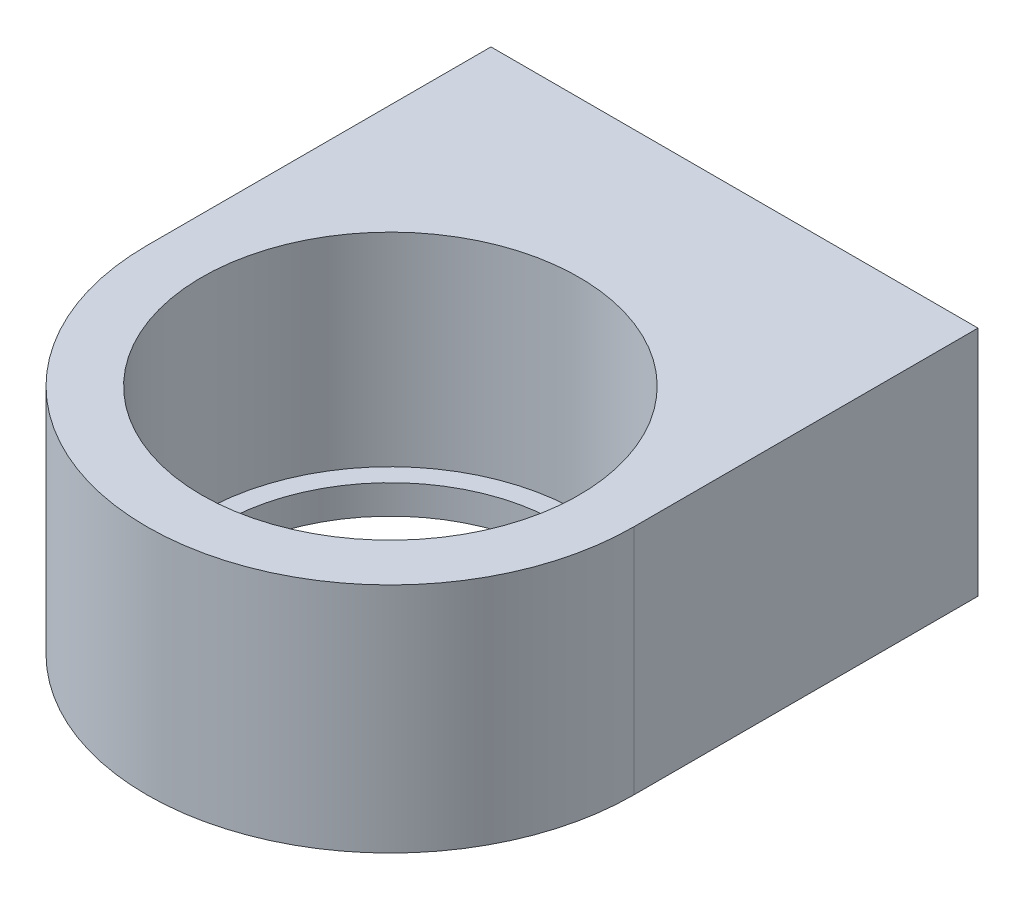
ISO-10303-21;
HEADER;
FILE_DESCRIPTION(('STEP AP214'),'2;1');
FILE_NAME('part.step','',(''),(''),'','','');
FILE_SCHEMA(('AUTOMOTIVE_DESIGN { 1 0 10303 214 1 1 1 1 }'));
ENDSEC;
DATA;
#1=APPLICATION_CONTEXT('core data for automotive mechanical design processes');
#2=APPLICATION_PROTOCOL_DEFINITION('international standard','automotive_design',2000,#1);
#3=PRODUCT_CONTEXT('',#1,'mechanical');
#4=PRODUCT('Part','Part','',(#3));
#5=PRODUCT_RELATED_PRODUCT_CATEGORY('part','',(#4));
#6=PRODUCT_DEFINITION_FORMATION('','',#4);
#7=PRODUCT_DEFINITION_CONTEXT('part definition',#1,'design');
#8=PRODUCT_DEFINITION('design','',#6,#7);
#9=PRODUCT_DEFINITION_SHAPE('','',#8);
#10=(LENGTH_UNIT() NAMED_UNIT(*) SI_UNIT(.MILLI.,.METRE.));
#11=(NAMED_UNIT(*) PLANE_ANGLE_UNIT() SI_UNIT($,.RADIAN.));
#12=(NAMED_UNIT(*) SI_UNIT($,.STERADIAN.) SOLID_ANGLE_UNIT());
#13=UNCERTAINTY_MEASURE_WITH_UNIT(LENGTH_MEASURE(1.E-05),#10,'distance_accuracy_value','');
#14=(GEOMETRIC_REPRESENTATION_CONTEXT(3) GLOBAL_UNCERTAINTY_ASSIGNED_CONTEXT((#13)) GLOBAL_UNIT_ASSIGNED_CONTEXT((#10,
#11,#12)) REPRESENTATION_CONTEXT('',''));
#15=CARTESIAN_POINT('',(0.,0.,0.));
#16=DIRECTION('',(0.,0.,1.));
#17=DIRECTION('',(1.,0.,0.));
#18=AXIS2_PLACEMENT_3D('',#15,#16,#17);
#19=CARTESIAN_POINT('',(0.,12.7,0.));
#20=DIRECTION('',(0.,-1.,0.));
#21=DIRECTION('',(0.,0.,-1.));
#22=AXIS2_PLACEMENT_3D('',#19,#20,#21);
#23=CYLINDRICAL_SURFACE('',#22,9.25);
#24=CARTESIAN_POINT('',(0.,0.,0.));
#25=DIRECTION('',(0.,1.,0.));
#26=DIRECTION('',(0.,0.,1.));
#27=AXIS2_PLACEMENT_3D('',#24,#25,#26);
#28=CIRCLE('',#27,9.25);
#29=CARTESIAN_POINT('',(0.,0.,9.25));
#30=VERTEX_POINT('',#29);
#31=EDGE_CURVE('E122',#30,#30,#28,.T.);
#32=ORIENTED_EDGE('',*,*,#31,.F.);
#33=EDGE_LOOP('',(#32));
#34=FACE_BOUND('',#33,.T.);
#35=CARTESIAN_POINT('',(0.,1.5875,0.));
#36=DIRECTION('',(0.,1.,0.));
#37=DIRECTION('',(0.,0.,1.));
#38=AXIS2_PLACEMENT_3D('',#35,#36,#37);
#39=CIRCLE('',#38,9.25);
#40=CARTESIAN_POINT('',(0.,1.5875,9.25));
#41=VERTEX_POINT('',#40);
#42=EDGE_CURVE('E37',#41,#41,#39,.T.);
#43=ORIENTED_EDGE('',*,*,#42,.T.);
#44=EDGE_LOOP('',(#43));
#45=FACE_BOUND('',#44,.T.);
#46=ADVANCED_FACE('F33',(#34,#45),#23,.F.);
#47=CARTESIAN_POINT('',(0.,12.7,0.));
#48=DIRECTION('',(0.,1.,0.));
#49=DIRECTION('',(0.,0.,1.));
#50=AXIS2_PLACEMENT_3D('',#47,#48,#49);
#51=PLANE('',#50);
#52=CARTESIAN_POINT('',(0.,12.7,0.));
#53=DIRECTION('',(0.,1.,0.));
#54=DIRECTION('',(0.,0.,1.));
#55=AXIS2_PLACEMENT_3D('',#52,#53,#54);
#56=CIRCLE('',#55,10.31875);
#57=CARTESIAN_POINT('',(0.,12.7,10.31875));
#58=VERTEX_POINT('',#57);
#59=EDGE_CURVE('E114',#58,#58,#56,.T.);
#60=ORIENTED_EDGE('',*,*,#59,.F.);
#61=EDGE_LOOP('',(#60));
#62=FACE_BOUND('',#61,.T.);
#63=DIRECTION('',(0.,0.,-1.));
#64=VECTOR('',#63,1.);
#65=CARTESIAN_POINT('',(13.31875,12.7,-13.31875));
#66=LINE('',#65,#64);
#67=CARTESIAN_POINT('',(13.31875,12.7,0.));
#68=VERTEX_POINT('',#67);
#69=CARTESIAN_POINT('',(13.31875,12.7,-18.81875));
#70=VERTEX_POINT('',#69);
#71=EDGE_CURVE('E67',#68,#70,#66,.T.);
#72=ORIENTED_EDGE('',*,*,#71,.T.);
#73=DIRECTION('',(1.,0.,0.));
#74=VECTOR('',#73,1.);
#75=CARTESIAN_POINT('',(-13.31875,12.7,-18.81875));
#76=LINE('',#75,#74);
#77=CARTESIAN_POINT('',(-13.31875,12.7,-18.81875));
#78=VERTEX_POINT('',#77);
#79=EDGE_CURVE('E100',#78,#70,#76,.T.);
#80=ORIENTED_EDGE('',*,*,#79,.F.);
#81=DIRECTION('',(0.,0.,1.));
#82=VECTOR('',#81,1.);
#83=CARTESIAN_POINT('',(-13.31875,12.7,-13.31875));
#84=LINE('',#83,#82);
#85=CARTESIAN_POINT('',(-13.31875,12.7,0.));
#86=VERTEX_POINT('',#85);
#87=EDGE_CURVE('E87',#78,#86,#84,.T.);
#88=ORIENTED_EDGE('',*,*,#87,.T.);
#89=CARTESIAN_POINT('',(0.,12.7,0.));
#90=DIRECTION('',(0.,1.,0.));
#91=DIRECTION('',(0.,0.,1.));
#92=AXIS2_PLACEMENT_3D('',#89,#90,#91);
#93=CIRCLE('',#92,13.31875);
#94=EDGE_CURVE('E51',#86,#68,#93,.T.);
#95=ORIENTED_EDGE('',*,*,#94,.T.);
#96=EDGE_LOOP('',(#72,#80,#88,#95));
#97=FACE_BOUND('',#96,.T.);
#98=ADVANCED_FACE('F132',(#62,#97),#51,.T.);
#99=CARTESIAN_POINT('',(0.,0.,0.));
#100=DIRECTION('',(0.,1.,0.));
#101=DIRECTION('',(0.,0.,1.));
#102=AXIS2_PLACEMENT_3D('',#99,#100,#101);
#103=PLANE('',#102);
#104=DIRECTION('',(0.,0.,1.));
#105=VECTOR('',#104,1.);
#106=CARTESIAN_POINT('',(-13.31875,0.,0.));
#107=LINE('',#106,#105);
#108=CARTESIAN_POINT('',(-13.31875,0.,-18.81875));
#109=VERTEX_POINT('',#108);
#110=CARTESIAN_POINT('',(-13.31875,0.,0.));
#111=VERTEX_POINT('',#110);
#112=EDGE_CURVE('E62',#109,#111,#107,.T.);
#113=ORIENTED_EDGE('',*,*,#112,.F.);
#114=DIRECTION('',(-1.,0.,0.));
#115=VECTOR('',#114,1.);
#116=CARTESIAN_POINT('',(13.31875,0.,-18.81875));
#117=LINE('',#116,#115);
#118=CARTESIAN_POINT('',(13.31875,0.,-18.81875));
#119=VERTEX_POINT('',#118);
#120=EDGE_CURVE('E91',#119,#109,#117,.T.);
#121=ORIENTED_EDGE('',*,*,#120,.F.);
#122=DIRECTION('',(0.,0.,-1.));
#123=VECTOR('',#122,1.);
#124=CARTESIAN_POINT('',(13.31875,0.,-17.81875));
#125=LINE('',#124,#123);
#126=CARTESIAN_POINT('',(13.31875,0.,0.));
#127=VERTEX_POINT('',#126);
#128=EDGE_CURVE('E79',#127,#119,#125,.T.);
#129=ORIENTED_EDGE('',*,*,#128,.F.);
#130=CARTESIAN_POINT('',(0.,0.,0.));
#131=DIRECTION('',(0.,1.,0.));
#132=DIRECTION('',(0.,0.,1.));
#133=AXIS2_PLACEMENT_3D('',#130,#131,#132);
#134=CIRCLE('',#133,13.31875);
#135=EDGE_CURVE('E88',#111,#127,#134,.T.);
#136=ORIENTED_EDGE('',*,*,#135,.F.);
#137=EDGE_LOOP('',(#113,#121,#129,#136));
#138=FACE_BOUND('',#137,.T.);
#139=ORIENTED_EDGE('',*,*,#31,.T.);
#140=EDGE_LOOP('',(#139));
#141=FACE_BOUND('',#140,.T.);
#142=ADVANCED_FACE('F92',(#138,#141),#103,.F.);
#143=CARTESIAN_POINT('',(-13.31875,12.7,0.));
#144=DIRECTION('',(1.,0.,0.));
#145=DIRECTION('',(0.,0.,-1.));
#146=AXIS2_PLACEMENT_3D('',#143,#144,#145);
#147=PLANE('',#146);
#148=ORIENTED_EDGE('',*,*,#112,.T.);
#149=DIRECTION('',(0.,-1.,0.));
#150=VECTOR('',#149,1.);
#151=CARTESIAN_POINT('',(-13.31875,12.7,0.));
#152=LINE('',#151,#150);
#153=EDGE_CURVE('E11',#86,#111,#152,.T.);
#154=ORIENTED_EDGE('',*,*,#153,.F.);
#155=ORIENTED_EDGE('',*,*,#87,.F.);
#156=DIRECTION('',(0.,1.,0.));
#157=VECTOR('',#156,1.);
#158=CARTESIAN_POINT('',(-13.31875,0.,-18.81875));
#159=LINE('',#158,#157);
#160=EDGE_CURVE('E96',#109,#78,#159,.T.);
#161=ORIENTED_EDGE('',*,*,#160,.F.);
#162=EDGE_LOOP('',(#148,#154,#155,#161));
#163=FACE_BOUND('',#162,.T.);
#164=ADVANCED_FACE('F35',(#163),#147,.F.);
#165=CARTESIAN_POINT('',(0.,12.7,0.));
#166=DIRECTION('',(0.,-1.,0.));
#167=DIRECTION('',(0.,0.,-1.));
#168=AXIS2_PLACEMENT_3D('',#165,#166,#167);
#169=CYLINDRICAL_SURFACE('',#168,13.31875);
#170=ORIENTED_EDGE('',*,*,#135,.T.);
#171=DIRECTION('',(0.,-1.,0.));
#172=VECTOR('',#171,1.);
#173=CARTESIAN_POINT('',(13.31875,12.7,0.));
#174=LINE('',#173,#172);
#175=EDGE_CURVE('E43',#68,#127,#174,.T.);
#176=ORIENTED_EDGE('',*,*,#175,.F.);
#177=ORIENTED_EDGE('',*,*,#94,.F.);
#178=ORIENTED_EDGE('',*,*,#153,.T.);
#179=EDGE_LOOP('',(#170,#176,#177,#178));
#180=FACE_BOUND('',#179,.T.);
#181=ADVANCED_FACE('F131',(#180),#169,.T.);
#182=CARTESIAN_POINT('',(13.31875,12.7,-17.81875));
#183=DIRECTION('',(-1.,0.,0.));
#184=DIRECTION('',(0.,0.,1.));
#185=AXIS2_PLACEMENT_3D('',#182,#183,#184);
#186=PLANE('',#185);
#187=ORIENTED_EDGE('',*,*,#128,.T.);
#188=DIRECTION('',(0.,-1.,0.));
#189=VECTOR('',#188,1.);
#190=CARTESIAN_POINT('',(13.31875,12.7,-18.81875));
#191=LINE('',#190,#189);
#192=EDGE_CURVE('E83',#70,#119,#191,.T.);
#193=ORIENTED_EDGE('',*,*,#192,.F.);
#194=ORIENTED_EDGE('',*,*,#71,.F.);
#195=ORIENTED_EDGE('',*,*,#175,.T.);
#196=EDGE_LOOP('',(#187,#193,#194,#195));
#197=FACE_BOUND('',#196,.T.);
#198=ADVANCED_FACE('F81',(#197),#186,.F.);
#199=CARTESIAN_POINT('',(0.,1.5875,0.));
#200=DIRECTION('',(0.,1.,0.));
#201=DIRECTION('',(0.,0.,1.));
#202=AXIS2_PLACEMENT_3D('',#199,#200,#201);
#203=CYLINDRICAL_SURFACE('',#202,10.31875);
#204=CARTESIAN_POINT('',(0.,1.5875,0.));
#205=DIRECTION('',(0.,1.,0.));
#206=DIRECTION('',(0.,0.,1.));
#207=AXIS2_PLACEMENT_3D('',#204,#205,#206);
#208=CIRCLE('',#207,10.31875);
#209=CARTESIAN_POINT('',(0.,1.5875,10.31875));
#210=VERTEX_POINT('',#209);
#211=EDGE_CURVE('E117',#210,#210,#208,.T.);
#212=ORIENTED_EDGE('',*,*,#211,.F.);
#213=EDGE_LOOP('',(#212));
#214=FACE_BOUND('',#213,.T.);
#215=ORIENTED_EDGE('',*,*,#59,.T.);
#216=EDGE_LOOP('',(#215));
#217=FACE_BOUND('',#216,.T.);
#218=ADVANCED_FACE('F148',(#214,#217),#203,.F.);
#219=CARTESIAN_POINT('',(0.,1.5875,0.));
#220=DIRECTION('',(0.,1.,0.));
#221=DIRECTION('',(0.,0.,1.));
#222=AXIS2_PLACEMENT_3D('',#219,#220,#221);
#223=PLANE('',#222);
#224=ORIENTED_EDGE('',*,*,#42,.F.);
#225=EDGE_LOOP('',(#224));
#226=FACE_BOUND('',#225,.T.);
#227=ORIENTED_EDGE('',*,*,#211,.T.);
#228=EDGE_LOOP('',(#227));
#229=FACE_BOUND('',#228,.T.);
#230=ADVANCED_FACE('F169',(#226,#229),#223,.T.);
#231=CARTESIAN_POINT('',(0.,0.,-18.81875));
#232=DIRECTION('',(0.,0.,-1.));
#233=DIRECTION('',(-1.,0.,0.));
#234=AXIS2_PLACEMENT_3D('',#231,#232,#233);
#235=PLANE('',#234);
#236=CARTESIAN_POINT('',(7.81875,6.35,-18.81875));
#237=DIRECTION('',(0.,0.,-1.));
#238=DIRECTION('',(-1.,0.,0.));
#239=AXIS2_PLACEMENT_3D('',#236,#237,#238);
#240=CIRCLE('',#239,3.);
#241=CARTESIAN_POINT('',(4.81875,6.35,-18.81875));
#242=VERTEX_POINT('',#241);
#243=EDGE_CURVE('E101',#242,#242,#240,.T.);
#244=ORIENTED_EDGE('',*,*,#243,.F.);
#245=EDGE_LOOP('',(#244));
#246=FACE_BOUND('',#245,.T.);
#247=ORIENTED_EDGE('',*,*,#192,.T.);
#248=ORIENTED_EDGE('',*,*,#120,.T.);
#249=ORIENTED_EDGE('',*,*,#160,.T.);
#250=ORIENTED_EDGE('',*,*,#79,.T.);
#251=EDGE_LOOP('',(#247,#248,#249,#250));
#252=FACE_BOUND('',#251,.T.);
#253=CARTESIAN_POINT('',(-7.81875,6.35,-18.81875));
#254=DIRECTION('',(0.,0.,-1.));
#255=DIRECTION('',(-1.,0.,0.));
#256=AXIS2_PLACEMENT_3D('',#253,#254,#255);
#257=CIRCLE('',#256,3.);
#258=CARTESIAN_POINT('',(-10.81875,6.35,-18.81875));
#259=VERTEX_POINT('',#258);
#260=EDGE_CURVE('E104',#259,#259,#257,.T.);
#261=ORIENTED_EDGE('',*,*,#260,.F.);
#262=EDGE_LOOP('',(#261));
#263=FACE_BOUND('',#262,.T.);
#264=ADVANCED_FACE('F98',(#246,#252,#263),#235,.T.);
#265=CARTESIAN_POINT('',(-7.81875,6.35,-10.31875));
#266=DIRECTION('',(0.,0.,-1.));
#267=DIRECTION('',(-1.,0.,0.));
#268=AXIS2_PLACEMENT_3D('',#265,#266,#267);
#269=PLANE('',#268);
#270=CARTESIAN_POINT('',(-7.81875,6.35,-10.31875));
#271=DIRECTION('',(0.,0.,-1.));
#272=DIRECTION('',(-1.,0.,0.));
#273=AXIS2_PLACEMENT_3D('',#270,#271,#272);
#274=CIRCLE('',#273,3.);
#275=CARTESIAN_POINT('',(-10.81875,6.35,-10.31875));
#276=VERTEX_POINT('',#275);
#277=EDGE_CURVE('E110',#276,#276,#274,.T.);
#278=ORIENTED_EDGE('',*,*,#277,.T.);
#279=EDGE_LOOP('',(#278));
#280=FACE_BOUND('',#279,.T.);
#281=ADVANCED_FACE('F168',(#280),#269,.T.);
#282=CARTESIAN_POINT('',(-7.81875,6.35,-10.31875));
#283=DIRECTION('',(0.,0.,-1.));
#284=DIRECTION('',(-1.,0.,0.));
#285=AXIS2_PLACEMENT_3D('',#282,#283,#284);
#286=CYLINDRICAL_SURFACE('',#285,3.);
#287=ORIENTED_EDGE('',*,*,#277,.F.);
#288=EDGE_LOOP('',(#287));
#289=FACE_BOUND('',#288,.T.);
#290=ORIENTED_EDGE('',*,*,#260,.T.);
#291=EDGE_LOOP('',(#290));
#292=FACE_BOUND('',#291,.T.);
#293=ADVANCED_FACE('F175',(#289,#292),#286,.F.);
#294=CARTESIAN_POINT('',(7.81875,6.35,-10.31875));
#295=DIRECTION('',(0.,0.,-1.));
#296=DIRECTION('',(-1.,0.,0.));
#297=AXIS2_PLACEMENT_3D('',#294,#295,#296);
#298=PLANE('',#297);
#299=CARTESIAN_POINT('',(7.81875,6.35,-10.31875));
#300=DIRECTION('',(0.,0.,-1.));
#301=DIRECTION('',(-1.,0.,0.));
#302=AXIS2_PLACEMENT_3D('',#299,#300,#301);
#303=CIRCLE('',#302,3.);
#304=CARTESIAN_POINT('',(4.81875,6.35,-10.31875));
#305=VERTEX_POINT('',#304);
#306=EDGE_CURVE('E111',#305,#305,#303,.T.);
#307=ORIENTED_EDGE('',*,*,#306,.T.);
#308=EDGE_LOOP('',(#307));
#309=FACE_BOUND('',#308,.T.);
#310=ADVANCED_FACE('F178',(#309),#298,.T.);
#311=CARTESIAN_POINT('',(7.81875,6.35,-10.31875));
#312=DIRECTION('',(0.,0.,-1.));
#313=DIRECTION('',(-1.,0.,0.));
#314=AXIS2_PLACEMENT_3D('',#311,#312,#313);
#315=CYLINDRICAL_SURFACE('',#314,3.);
#316=ORIENTED_EDGE('',*,*,#306,.F.);
#317=EDGE_LOOP('',(#316));
#318=FACE_BOUND('',#317,.T.);
#319=ORIENTED_EDGE('',*,*,#243,.T.);
#320=EDGE_LOOP('',(#319));
#321=FACE_BOUND('',#320,.T.);
#322=ADVANCED_FACE('F184',(#318,#321),#315,.F.);
#323=CLOSED_SHELL('',(#46,#98,#142,#164,#181,#198,#218,#230,#264,#281,#293,#310,#322));
#324=MANIFOLD_SOLID_BREP('B2',#323);
#325=ADVANCED_BREP_SHAPE_REPRESENTATION('',(#18,#324),#14);
#326=SHAPE_DEFINITION_REPRESENTATION(#9,#325);
ENDSEC;
END-ISO-10303-21;
